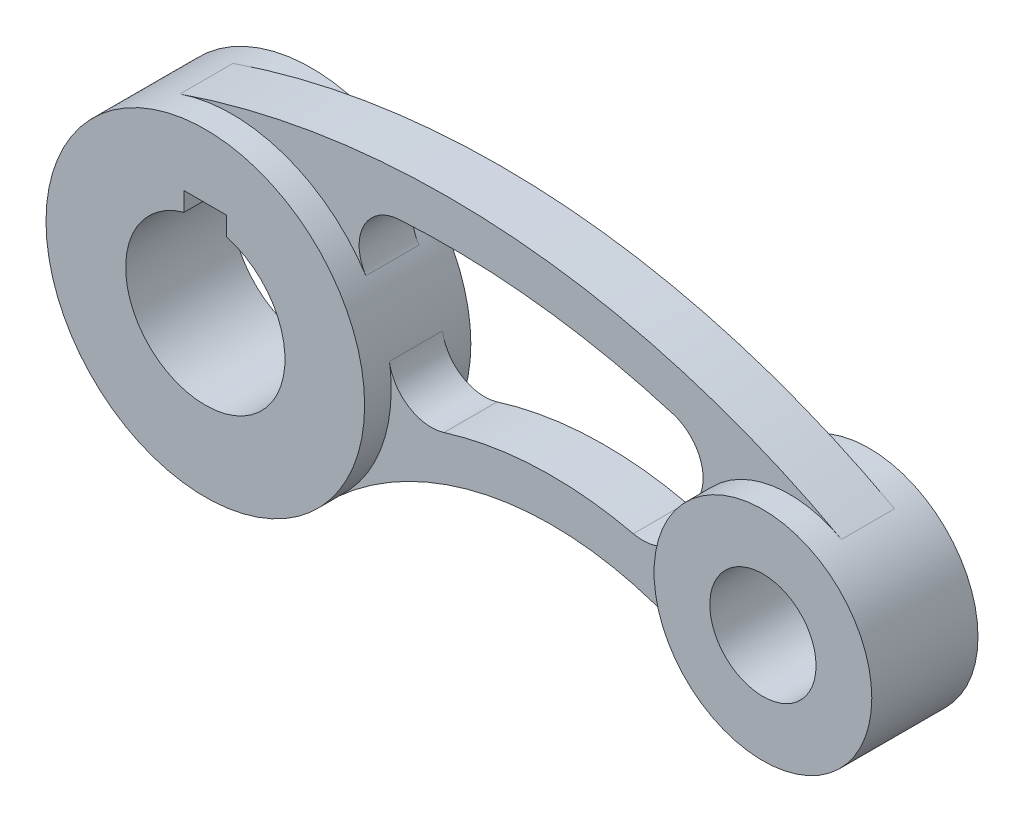
ISO-10303-21;
HEADER;
FILE_DESCRIPTION(('STEP AP214'),'2;1');
FILE_NAME('part.step','',(''),(''),'','','');
FILE_SCHEMA(('AUTOMOTIVE_DESIGN { 1 0 10303 214 1 1 1 1 }'));
ENDSEC;
DATA;
#1=APPLICATION_CONTEXT('core data for automotive mechanical design processes');
#2=APPLICATION_PROTOCOL_DEFINITION('international standard','automotive_design',2000,#1);
#3=PRODUCT_CONTEXT('',#1,'mechanical');
#4=PRODUCT('Part','Part','',(#3));
#5=PRODUCT_RELATED_PRODUCT_CATEGORY('part','',(#4));
#6=PRODUCT_DEFINITION_FORMATION('','',#4);
#7=PRODUCT_DEFINITION_CONTEXT('part definition',#1,'design');
#8=PRODUCT_DEFINITION('design','',#6,#7);
#9=PRODUCT_DEFINITION_SHAPE('','',#8);
#10=(LENGTH_UNIT() NAMED_UNIT(*) SI_UNIT(.MILLI.,.METRE.));
#11=(NAMED_UNIT(*) PLANE_ANGLE_UNIT() SI_UNIT($,.RADIAN.));
#12=(NAMED_UNIT(*) SI_UNIT($,.STERADIAN.) SOLID_ANGLE_UNIT());
#13=UNCERTAINTY_MEASURE_WITH_UNIT(LENGTH_MEASURE(1.E-05),#10,'distance_accuracy_value','');
#14=(GEOMETRIC_REPRESENTATION_CONTEXT(3) GLOBAL_UNCERTAINTY_ASSIGNED_CONTEXT((#13)) GLOBAL_UNIT_ASSIGNED_CONTEXT((#10,
#11,#12)) REPRESENTATION_CONTEXT('',''));
#15=CARTESIAN_POINT('',(0.,0.,0.));
#16=DIRECTION('',(0.,0.,1.));
#17=DIRECTION('',(1.,0.,0.));
#18=AXIS2_PLACEMENT_3D('',#15,#16,#17);
#19=CARTESIAN_POINT('',(-105.,0.,-10.));
#20=DIRECTION('',(0.,0.,1.));
#21=DIRECTION('',(1.,0.,0.));
#22=AXIS2_PLACEMENT_3D('',#19,#20,#21);
#23=CYLINDRICAL_SURFACE('',#22,30.);
#24=CARTESIAN_POINT('',(-105.,0.,-10.));
#25=DIRECTION('',(0.,0.,1.));
#26=DIRECTION('',(1.,0.,0.));
#27=AXIS2_PLACEMENT_3D('',#24,#25,#26);
#28=CIRCLE('',#27,30.);
#29=CARTESIAN_POINT('',(-75.,0.,-10.));
#30=VERTEX_POINT('',#29);
#31=EDGE_CURVE('E287',#30,#30,#28,.T.);
#32=ORIENTED_EDGE('',*,*,#31,.T.);
#33=EDGE_LOOP('',(#32));
#34=FACE_BOUND('',#33,.T.);
#35=CARTESIAN_POINT('',(-105.,0.,10.));
#36=DIRECTION('',(0.,0.,1.));
#37=DIRECTION('',(1.,0.,0.));
#38=AXIS2_PLACEMENT_3D('',#35,#36,#37);
#39=CIRCLE('',#38,30.);
#40=CARTESIAN_POINT('',(-75.,0.,10.));
#41=VERTEX_POINT('',#40);
#42=EDGE_CURVE('E275',#41,#41,#39,.T.);
#43=ORIENTED_EDGE('',*,*,#42,.F.);
#44=EDGE_LOOP('',(#43));
#45=FACE_BOUND('',#44,.T.);
#46=DIRECTION('',(0.,0.,1.));
#47=VECTOR('',#46,1.);
#48=CARTESIAN_POINT('',(-114.782571428571,28.3602062094918,-5.));
#49=LINE('',#48,#47);
#50=CARTESIAN_POINT('',(-114.782571428571,28.3602062094918,-5.));
#51=VERTEX_POINT('',#50);
#52=CARTESIAN_POINT('',(-114.782571428571,28.3602062094918,5.));
#53=VERTEX_POINT('',#52);
#54=EDGE_CURVE('E261',#51,#53,#49,.T.);
#55=ORIENTED_EDGE('',*,*,#54,.F.);
#56=CARTESIAN_POINT('',(-105.,0.,-5.));
#57=DIRECTION('',(0.,0.,1.));
#58=DIRECTION('',(1.,0.,0.));
#59=AXIS2_PLACEMENT_3D('',#56,#57,#58);
#60=CIRCLE('',#59,30.);
#61=CARTESIAN_POINT('',(-79.7671344661695,16.2265984405737,-5.));
#62=VERTEX_POINT('',#61);
#63=EDGE_CURVE('E239',#62,#51,#60,.T.);
#64=ORIENTED_EDGE('',*,*,#63,.F.);
#65=DIRECTION('',(0.,0.,1.));
#66=VECTOR('',#65,1.);
#67=CARTESIAN_POINT('',(-79.7671344661695,16.2265984405737,-5.));
#68=LINE('',#67,#66);
#69=CARTESIAN_POINT('',(-79.7671344661695,16.2265984405737,5.));
#70=VERTEX_POINT('',#69);
#71=EDGE_CURVE('E259',#62,#70,#68,.T.);
#72=ORIENTED_EDGE('',*,*,#71,.T.);
#73=CARTESIAN_POINT('',(-105.,0.,5.));
#74=DIRECTION('',(0.,0.,1.));
#75=DIRECTION('',(1.,0.,0.));
#76=AXIS2_PLACEMENT_3D('',#73,#74,#75);
#77=CIRCLE('',#76,30.);
#78=EDGE_CURVE('E223',#70,#53,#77,.T.);
#79=ORIENTED_EDGE('',*,*,#78,.T.);
#80=EDGE_LOOP('',(#55,#64,#72,#79));
#81=FACE_BOUND('',#80,.T.);
#82=CARTESIAN_POINT('',(-105.,0.,-5.));
#83=DIRECTION('',(0.,0.,1.));
#84=DIRECTION('',(1.,0.,0.));
#85=AXIS2_PLACEMENT_3D('',#82,#83,#84);
#86=CIRCLE('',#85,30.);
#87=CARTESIAN_POINT('',(-84.9289682539683,-22.2969433925322,-5.));
#88=VERTEX_POINT('',#87);
#89=CARTESIAN_POINT('',(-75.3346025355009,4.46813084782583,-5.));
#90=VERTEX_POINT('',#89);
#91=EDGE_CURVE('E183',#88,#90,#86,.T.);
#92=ORIENTED_EDGE('',*,*,#91,.F.);
#93=DIRECTION('',(0.,0.,-1.));
#94=VECTOR('',#93,1.);
#95=CARTESIAN_POINT('',(-84.9289682539682,-22.2969433925322,5.));
#96=LINE('',#95,#94);
#97=CARTESIAN_POINT('',(-84.9289682539682,-22.2969433925322,5.));
#98=VERTEX_POINT('',#97);
#99=EDGE_CURVE('E54',#98,#88,#96,.T.);
#100=ORIENTED_EDGE('',*,*,#99,.F.);
#101=CARTESIAN_POINT('',(-105.,0.,5.));
#102=DIRECTION('',(0.,0.,1.));
#103=DIRECTION('',(1.,0.,0.));
#104=AXIS2_PLACEMENT_3D('',#101,#102,#103);
#105=CIRCLE('',#104,30.);
#106=CARTESIAN_POINT('',(-75.3346025355009,4.46813084782583,5.));
#107=VERTEX_POINT('',#106);
#108=EDGE_CURVE('E195',#98,#107,#105,.T.);
#109=ORIENTED_EDGE('',*,*,#108,.T.);
#110=DIRECTION('',(0.,0.,-1.));
#111=VECTOR('',#110,1.);
#112=CARTESIAN_POINT('',(-75.3346025355009,4.46813084782583,5.));
#113=LINE('',#112,#111);
#114=EDGE_CURVE('E61',#107,#90,#113,.T.);
#115=ORIENTED_EDGE('',*,*,#114,.T.);
#116=EDGE_LOOP('',(#92,#100,#109,#115));
#117=FACE_BOUND('',#116,.T.);
#118=ADVANCED_FACE('F37',(#34,#45,#81,#117),#23,.T.);
#119=CARTESIAN_POINT('',(-105.,0.,-10.));
#120=DIRECTION('',(0.,0.,1.));
#121=DIRECTION('',(1.,0.,0.));
#122=AXIS2_PLACEMENT_3D('',#119,#120,#121);
#123=CYLINDRICAL_SURFACE('',#122,15.);
#124=DIRECTION('',(0.,0.,1.));
#125=VECTOR('',#124,1.);
#126=CARTESIAN_POINT('',(-109.,14.456832294801,-10.));
#127=LINE('',#126,#125);
#128=CARTESIAN_POINT('',(-109.,14.456832294801,-10.));
#129=VERTEX_POINT('',#128);
#130=CARTESIAN_POINT('',(-109.,14.456832294801,10.));
#131=VERTEX_POINT('',#130);
#132=EDGE_CURVE('E41',#129,#131,#127,.T.);
#133=ORIENTED_EDGE('',*,*,#132,.T.);
#134=CARTESIAN_POINT('',(-105.,0.,10.));
#135=DIRECTION('',(0.,0.,1.));
#136=DIRECTION('',(1.,0.,0.));
#137=AXIS2_PLACEMENT_3D('',#134,#135,#136);
#138=CIRCLE('',#137,15.);
#139=CARTESIAN_POINT('',(-101.,14.456832294801,10.));
#140=VERTEX_POINT('',#139);
#141=EDGE_CURVE('E254',#131,#140,#138,.T.);
#142=ORIENTED_EDGE('',*,*,#141,.T.);
#143=DIRECTION('',(0.,0.,1.));
#144=VECTOR('',#143,1.);
#145=CARTESIAN_POINT('',(-101.,14.456832294801,-10.));
#146=LINE('',#145,#144);
#147=CARTESIAN_POINT('',(-101.,14.456832294801,-10.));
#148=VERTEX_POINT('',#147);
#149=EDGE_CURVE('E11',#148,#140,#146,.T.);
#150=ORIENTED_EDGE('',*,*,#149,.F.);
#151=CARTESIAN_POINT('',(-105.,0.,-10.));
#152=DIRECTION('',(0.,0.,1.));
#153=DIRECTION('',(1.,0.,0.));
#154=AXIS2_PLACEMENT_3D('',#151,#152,#153);
#155=CIRCLE('',#154,15.);
#156=EDGE_CURVE('E278',#129,#148,#155,.T.);
#157=ORIENTED_EDGE('',*,*,#156,.F.);
#158=EDGE_LOOP('',(#133,#142,#150,#157));
#159=FACE_BOUND('',#158,.T.);
#160=ADVANCED_FACE('F39',(#159),#123,.F.);
#161=CARTESIAN_POINT('',(-101.,0.,-10.));
#162=DIRECTION('',(1.,0.,0.));
#163=DIRECTION('',(0.,0.,-1.));
#164=AXIS2_PLACEMENT_3D('',#161,#162,#163);
#165=PLANE('',#164);
#166=ORIENTED_EDGE('',*,*,#149,.T.);
#167=DIRECTION('',(0.,1.,0.));
#168=VECTOR('',#167,1.);
#169=CARTESIAN_POINT('',(-101.,0.,10.));
#170=LINE('',#169,#168);
#171=CARTESIAN_POINT('',(-101.,18.,10.));
#172=VERTEX_POINT('',#171);
#173=EDGE_CURVE('E272',#140,#172,#170,.T.);
#174=ORIENTED_EDGE('',*,*,#173,.T.);
#175=DIRECTION('',(0.,0.,1.));
#176=VECTOR('',#175,1.);
#177=CARTESIAN_POINT('',(-101.,18.,-10.));
#178=LINE('',#177,#176);
#179=CARTESIAN_POINT('',(-101.,18.,-10.));
#180=VERTEX_POINT('',#179);
#181=EDGE_CURVE('E46',#180,#172,#178,.T.);
#182=ORIENTED_EDGE('',*,*,#181,.F.);
#183=DIRECTION('',(0.,1.,0.));
#184=VECTOR('',#183,1.);
#185=CARTESIAN_POINT('',(-101.,0.,-10.));
#186=LINE('',#185,#184);
#187=EDGE_CURVE('E285',#148,#180,#186,.T.);
#188=ORIENTED_EDGE('',*,*,#187,.F.);
#189=EDGE_LOOP('',(#166,#174,#182,#188));
#190=FACE_BOUND('',#189,.T.);
#191=ADVANCED_FACE('F315',(#190),#165,.F.);
#192=CARTESIAN_POINT('',(0.,18.,-10.));
#193=DIRECTION('',(0.,1.,0.));
#194=DIRECTION('',(0.,0.,1.));
#195=AXIS2_PLACEMENT_3D('',#192,#193,#194);
#196=PLANE('',#195);
#197=ORIENTED_EDGE('',*,*,#181,.T.);
#198=DIRECTION('',(-1.,0.,0.));
#199=VECTOR('',#198,1.);
#200=CARTESIAN_POINT('',(0.,18.,10.));
#201=LINE('',#200,#199);
#202=CARTESIAN_POINT('',(-109.,18.,10.));
#203=VERTEX_POINT('',#202);
#204=EDGE_CURVE('E269',#172,#203,#201,.T.);
#205=ORIENTED_EDGE('',*,*,#204,.T.);
#206=DIRECTION('',(0.,0.,1.));
#207=VECTOR('',#206,1.);
#208=CARTESIAN_POINT('',(-109.,18.,-10.));
#209=LINE('',#208,#207);
#210=CARTESIAN_POINT('',(-109.,18.,-10.));
#211=VERTEX_POINT('',#210);
#212=EDGE_CURVE('E290',#211,#203,#209,.T.);
#213=ORIENTED_EDGE('',*,*,#212,.F.);
#214=DIRECTION('',(-1.,0.,0.));
#215=VECTOR('',#214,1.);
#216=CARTESIAN_POINT('',(0.,18.,-10.));
#217=LINE('',#216,#215);
#218=EDGE_CURVE('E283',#180,#211,#217,.T.);
#219=ORIENTED_EDGE('',*,*,#218,.F.);
#220=EDGE_LOOP('',(#197,#205,#213,#219));
#221=FACE_BOUND('',#220,.T.);
#222=ADVANCED_FACE('F308',(#221),#196,.F.);
#223=CARTESIAN_POINT('',(-109.,0.,-10.));
#224=DIRECTION('',(-1.,0.,0.));
#225=DIRECTION('',(0.,0.,1.));
#226=AXIS2_PLACEMENT_3D('',#223,#224,#225);
#227=PLANE('',#226);
#228=ORIENTED_EDGE('',*,*,#212,.T.);
#229=DIRECTION('',(0.,-1.,0.));
#230=VECTOR('',#229,1.);
#231=CARTESIAN_POINT('',(-109.,0.,10.));
#232=LINE('',#231,#230);
#233=EDGE_CURVE('E266',#203,#131,#232,.T.);
#234=ORIENTED_EDGE('',*,*,#233,.T.);
#235=ORIENTED_EDGE('',*,*,#132,.F.);
#236=DIRECTION('',(0.,-1.,0.));
#237=VECTOR('',#236,1.);
#238=CARTESIAN_POINT('',(-109.,0.,-10.));
#239=LINE('',#238,#237);
#240=EDGE_CURVE('E281',#211,#129,#239,.T.);
#241=ORIENTED_EDGE('',*,*,#240,.F.);
#242=EDGE_LOOP('',(#228,#234,#235,#241));
#243=FACE_BOUND('',#242,.T.);
#244=ADVANCED_FACE('F305',(#243),#227,.F.);
#245=CARTESIAN_POINT('',(0.,0.,-10.));
#246=DIRECTION('',(0.,0.,1.));
#247=DIRECTION('',(1.,0.,0.));
#248=AXIS2_PLACEMENT_3D('',#245,#246,#247);
#249=PLANE('',#248);
#250=ORIENTED_EDGE('',*,*,#156,.T.);
#251=ORIENTED_EDGE('',*,*,#187,.T.);
#252=ORIENTED_EDGE('',*,*,#218,.T.);
#253=ORIENTED_EDGE('',*,*,#240,.T.);
#254=EDGE_LOOP('',(#250,#251,#252,#253));
#255=FACE_BOUND('',#254,.T.);
#256=ORIENTED_EDGE('',*,*,#31,.F.);
#257=EDGE_LOOP('',(#256));
#258=FACE_BOUND('',#257,.T.);
#259=ADVANCED_FACE('F307',(#255,#258),#249,.F.);
#260=CARTESIAN_POINT('',(0.,0.,10.));
#261=DIRECTION('',(0.,0.,1.));
#262=DIRECTION('',(1.,0.,0.));
#263=AXIS2_PLACEMENT_3D('',#260,#261,#262);
#264=PLANE('',#263);
#265=ORIENTED_EDGE('',*,*,#141,.F.);
#266=ORIENTED_EDGE('',*,*,#233,.F.);
#267=ORIENTED_EDGE('',*,*,#204,.F.);
#268=ORIENTED_EDGE('',*,*,#173,.F.);
#269=EDGE_LOOP('',(#265,#266,#267,#268));
#270=FACE_BOUND('',#269,.T.);
#271=ORIENTED_EDGE('',*,*,#42,.T.);
#272=EDGE_LOOP('',(#271));
#273=FACE_BOUND('',#272,.T.);
#274=ADVANCED_FACE('F302',(#270,#273),#264,.T.);
#275=CARTESIAN_POINT('',(-24.2588248443126,14.9585900797153,-5.));
#276=DIRECTION('',(0.,0.,1.));
#277=DIRECTION('',(1.,0.,0.));
#278=AXIS2_PLACEMENT_3D('',#275,#276,#277);
#279=CYLINDRICAL_SURFACE('',#278,8.);
#280=CARTESIAN_POINT('',(-24.2588248443126,14.9585900797153,5.));
#281=DIRECTION('',(0.,0.,1.));
#282=DIRECTION('',(1.,0.,0.));
#283=AXIS2_PLACEMENT_3D('',#280,#281,#282);
#284=CIRCLE('',#283,8.);
#285=CARTESIAN_POINT('',(-21.9577911251774,22.6205248108001,5.));
#286=VERTEX_POINT('',#285);
#287=CARTESIAN_POINT('',(-17.4493301511723,10.7596876011987,5.));
#288=VERTEX_POINT('',#287);
#289=EDGE_CURVE('E232',#286,#288,#284,.F.);
#290=ORIENTED_EDGE('',*,*,#289,.F.);
#291=DIRECTION('',(0.,0.,1.));
#292=VECTOR('',#291,1.);
#293=CARTESIAN_POINT('',(-21.9577911251774,22.6205248108001,-5.));
#294=LINE('',#293,#292);
#295=CARTESIAN_POINT('',(-21.9577911251774,22.6205248108001,-5.));
#296=VERTEX_POINT('',#295);
#297=EDGE_CURVE('E255',#296,#286,#294,.T.);
#298=ORIENTED_EDGE('',*,*,#297,.F.);
#299=CARTESIAN_POINT('',(-24.2588248443126,14.9585900797153,-5.));
#300=DIRECTION('',(0.,0.,1.));
#301=DIRECTION('',(1.,0.,0.));
#302=AXIS2_PLACEMENT_3D('',#299,#300,#301);
#303=CIRCLE('',#302,8.);
#304=CARTESIAN_POINT('',(-17.4493301511722,10.7596876011987,-5.));
#305=VERTEX_POINT('',#304);
#306=EDGE_CURVE('E248',#296,#305,#303,.F.);
#307=ORIENTED_EDGE('',*,*,#306,.T.);
#308=DIRECTION('',(0.,0.,1.));
#309=VECTOR('',#308,1.);
#310=CARTESIAN_POINT('',(-17.4493301511722,10.7596876011987,-5.));
#311=LINE('',#310,#309);
#312=EDGE_CURVE('E252',#305,#288,#311,.T.);
#313=ORIENTED_EDGE('',*,*,#312,.T.);
#314=EDGE_LOOP('',(#290,#298,#307,#313));
#315=FACE_BOUND('',#314,.T.);
#316=ADVANCED_FACE('F360',(#315),#279,.F.);
#317=CARTESIAN_POINT('',(-64.2392857142857,-118.167525872883,-5.));
#318=DIRECTION('',(0.,0.,1.));
#319=DIRECTION('',(1.,0.,0.));
#320=AXIS2_PLACEMENT_3D('',#317,#318,#319);
#321=CYLINDRICAL_SURFACE('',#320,147.);
#322=CARTESIAN_POINT('',(-64.2392857142857,-118.167525872883,5.));
#323=DIRECTION('',(0.,0.,1.));
#324=DIRECTION('',(1.,0.,0.));
#325=AXIS2_PLACEMENT_3D('',#322,#323,#324);
#326=CIRCLE('',#325,147.);
#327=CARTESIAN_POINT('',(-73.5447924596149,28.5376463066034,5.));
#328=VERTEX_POINT('',#327);
#329=EDGE_CURVE('E229',#328,#286,#326,.F.);
#330=ORIENTED_EDGE('',*,*,#329,.F.);
#331=DIRECTION('',(0.,0.,1.));
#332=VECTOR('',#331,1.);
#333=CARTESIAN_POINT('',(-73.5447924596149,28.5376463066034,-5.));
#334=LINE('',#333,#332);
#335=CARTESIAN_POINT('',(-73.5447924596149,28.5376463066034,-5.));
#336=VERTEX_POINT('',#335);
#337=EDGE_CURVE('E257',#336,#328,#334,.T.);
#338=ORIENTED_EDGE('',*,*,#337,.F.);
#339=CARTESIAN_POINT('',(-64.2392857142857,-118.167525872883,-5.));
#340=DIRECTION('',(0.,0.,1.));
#341=DIRECTION('',(1.,0.,0.));
#342=AXIS2_PLACEMENT_3D('',#339,#340,#341);
#343=CIRCLE('',#342,147.);
#344=EDGE_CURVE('E245',#336,#296,#343,.F.);
#345=ORIENTED_EDGE('',*,*,#344,.T.);
#346=ORIENTED_EDGE('',*,*,#297,.T.);
#347=EDGE_LOOP('',(#330,#338,#345,#346));
#348=FACE_BOUND('',#347,.T.);
#349=ADVANCED_FACE('F375',(#348),#321,.F.);
#350=CARTESIAN_POINT('',(-73.0383703238147,20.55369135806,-5.));
#351=DIRECTION('',(0.,0.,1.));
#352=DIRECTION('',(1.,0.,0.));
#353=AXIS2_PLACEMENT_3D('',#350,#351,#352);
#354=CYLINDRICAL_SURFACE('',#353,8.);
#355=CARTESIAN_POINT('',(-73.0383703238147,20.55369135806,5.));
#356=DIRECTION('',(0.,0.,1.));
#357=DIRECTION('',(1.,0.,0.));
#358=AXIS2_PLACEMENT_3D('',#355,#356,#357);
#359=CIRCLE('',#358,8.);
#360=EDGE_CURVE('E226',#328,#70,#359,.T.);
#361=ORIENTED_EDGE('',*,*,#360,.T.);
#362=ORIENTED_EDGE('',*,*,#71,.F.);
#363=CARTESIAN_POINT('',(-73.0383703238147,20.55369135806,-5.));
#364=DIRECTION('',(0.,0.,1.));
#365=DIRECTION('',(1.,0.,0.));
#366=AXIS2_PLACEMENT_3D('',#363,#364,#365);
#367=CIRCLE('',#366,8.);
#368=EDGE_CURVE('E242',#336,#62,#367,.T.);
#369=ORIENTED_EDGE('',*,*,#368,.F.);
#370=ORIENTED_EDGE('',*,*,#337,.T.);
#371=EDGE_LOOP('',(#361,#362,#369,#370));
#372=FACE_BOUND('',#371,.T.);
#373=ADVANCED_FACE('F385',(#372),#354,.F.);
#374=CARTESIAN_POINT('',(-64.2392857142857,-118.167525872883,-5.));
#375=DIRECTION('',(0.,0.,1.));
#376=DIRECTION('',(1.,0.,0.));
#377=AXIS2_PLACEMENT_3D('',#374,#375,#376);
#378=CYLINDRICAL_SURFACE('',#377,155.);
#379=CARTESIAN_POINT('',(-64.2392857142857,-118.167525872883,5.));
#380=DIRECTION('',(0.,0.,1.));
#381=DIRECTION('',(1.,0.,0.));
#382=AXIS2_PLACEMENT_3D('',#379,#380,#381);
#383=CIRCLE('',#382,155.);
#384=CARTESIAN_POINT('',(9.7911178969729,18.0106637947516,5.));
#385=VERTEX_POINT('',#384);
#386=EDGE_CURVE('E220',#53,#385,#383,.F.);
#387=ORIENTED_EDGE('',*,*,#386,.T.);
#388=DIRECTION('',(0.,0.,1.));
#389=VECTOR('',#388,1.);
#390=CARTESIAN_POINT('',(9.7911178969729,18.0106637947516,-5.));
#391=LINE('',#390,#389);
#392=CARTESIAN_POINT('',(9.7911178969729,18.0106637947516,-5.));
#393=VERTEX_POINT('',#392);
#394=EDGE_CURVE('E251',#393,#385,#391,.T.);
#395=ORIENTED_EDGE('',*,*,#394,.F.);
#396=CARTESIAN_POINT('',(-64.2392857142857,-118.167525872883,-5.));
#397=DIRECTION('',(0.,0.,1.));
#398=DIRECTION('',(1.,0.,0.));
#399=AXIS2_PLACEMENT_3D('',#396,#397,#398);
#400=CIRCLE('',#399,155.);
#401=EDGE_CURVE('E237',#51,#393,#400,.F.);
#402=ORIENTED_EDGE('',*,*,#401,.F.);
#403=ORIENTED_EDGE('',*,*,#54,.T.);
#404=EDGE_LOOP('',(#387,#395,#402,#403));
#405=FACE_BOUND('',#404,.T.);
#406=ADVANCED_FACE('F395',(#405),#378,.T.);
#407=CARTESIAN_POINT('',(0.,0.,-5.));
#408=DIRECTION('',(0.,0.,1.));
#409=DIRECTION('',(1.,0.,0.));
#410=AXIS2_PLACEMENT_3D('',#407,#408,#409);
#411=PLANE('',#410);
#412=CARTESIAN_POINT('',(0.,0.,-5.));
#413=DIRECTION('',(0.,0.,1.));
#414=DIRECTION('',(1.,0.,0.));
#415=AXIS2_PLACEMENT_3D('',#412,#413,#414);
#416=CIRCLE('',#415,20.5);
#417=EDGE_CURVE('E235',#393,#305,#416,.T.);
#418=ORIENTED_EDGE('',*,*,#417,.T.);
#419=ORIENTED_EDGE('',*,*,#306,.F.);
#420=ORIENTED_EDGE('',*,*,#344,.F.);
#421=ORIENTED_EDGE('',*,*,#368,.T.);
#422=ORIENTED_EDGE('',*,*,#63,.T.);
#423=ORIENTED_EDGE('',*,*,#401,.T.);
#424=EDGE_LOOP('',(#418,#419,#420,#421,#422,#423));
#425=FACE_BOUND('',#424,.T.);
#426=ADVANCED_FACE('F405',(#425),#411,.F.);
#427=CARTESIAN_POINT('',(0.,0.,5.));
#428=DIRECTION('',(0.,0.,1.));
#429=DIRECTION('',(1.,0.,0.));
#430=AXIS2_PLACEMENT_3D('',#427,#428,#429);
#431=PLANE('',#430);
#432=CARTESIAN_POINT('',(0.,0.,5.));
#433=DIRECTION('',(0.,0.,1.));
#434=DIRECTION('',(1.,0.,0.));
#435=AXIS2_PLACEMENT_3D('',#432,#433,#434);
#436=CIRCLE('',#435,20.5);
#437=EDGE_CURVE('E217',#385,#288,#436,.T.);
#438=ORIENTED_EDGE('',*,*,#437,.F.);
#439=ORIENTED_EDGE('',*,*,#386,.F.);
#440=ORIENTED_EDGE('',*,*,#78,.F.);
#441=ORIENTED_EDGE('',*,*,#360,.F.);
#442=ORIENTED_EDGE('',*,*,#329,.T.);
#443=ORIENTED_EDGE('',*,*,#289,.T.);
#444=EDGE_LOOP('',(#438,#439,#440,#441,#442,#443));
#445=FACE_BOUND('',#444,.T.);
#446=ADVANCED_FACE('F415',(#445),#431,.T.);
#447=CARTESIAN_POINT('',(0.,0.,-10.));
#448=DIRECTION('',(0.,0.,1.));
#449=DIRECTION('',(1.,0.,0.));
#450=AXIS2_PLACEMENT_3D('',#447,#448,#449);
#451=CYLINDRICAL_SURFACE('',#450,20.5);
#452=DIRECTION('',(0.,0.,-1.));
#453=VECTOR('',#452,1.);
#454=CARTESIAN_POINT('',(-11.4053608399882,-17.0343107905681,5.));
#455=LINE('',#454,#453);
#456=CARTESIAN_POINT('',(-11.4053608399882,-17.0343107905681,5.));
#457=VERTEX_POINT('',#456);
#458=CARTESIAN_POINT('',(-11.4053608399882,-17.0343107905681,-5.));
#459=VERTEX_POINT('',#458);
#460=EDGE_CURVE('E199',#457,#459,#455,.T.);
#461=ORIENTED_EDGE('',*,*,#460,.T.);
#462=CARTESIAN_POINT('',(0.,0.,-5.));
#463=DIRECTION('',(0.,0.,1.));
#464=DIRECTION('',(1.,0.,0.));
#465=AXIS2_PLACEMENT_3D('',#462,#463,#464);
#466=CIRCLE('',#465,20.5);
#467=CARTESIAN_POINT('',(-19.8465572357473,5.1346047450806,-5.));
#468=VERTEX_POINT('',#467);
#469=EDGE_CURVE('E178',#468,#459,#466,.T.);
#470=ORIENTED_EDGE('',*,*,#469,.F.);
#471=DIRECTION('',(0.,0.,-1.));
#472=VECTOR('',#471,1.);
#473=CARTESIAN_POINT('',(-19.8465572357473,5.1346047450806,5.));
#474=LINE('',#473,#472);
#475=CARTESIAN_POINT('',(-19.8465572357473,5.1346047450806,5.));
#476=VERTEX_POINT('',#475);
#477=EDGE_CURVE('E164',#476,#468,#474,.T.);
#478=ORIENTED_EDGE('',*,*,#477,.F.);
#479=CARTESIAN_POINT('',(0.,0.,5.));
#480=DIRECTION('',(0.,0.,1.));
#481=DIRECTION('',(1.,0.,0.));
#482=AXIS2_PLACEMENT_3D('',#479,#480,#481);
#483=CIRCLE('',#482,20.5);
#484=EDGE_CURVE('E187',#476,#457,#483,.T.);
#485=ORIENTED_EDGE('',*,*,#484,.T.);
#486=EDGE_LOOP('',(#461,#470,#478,#485));
#487=FACE_BOUND('',#486,.T.);
#488=CARTESIAN_POINT('',(0.,0.,10.));
#489=DIRECTION('',(0.,0.,1.));
#490=DIRECTION('',(1.,0.,0.));
#491=AXIS2_PLACEMENT_3D('',#488,#489,#490);
#492=CIRCLE('',#491,20.5);
#493=CARTESIAN_POINT('',(20.5,0.,10.));
#494=VERTEX_POINT('',#493);
#495=EDGE_CURVE('E208',#494,#494,#492,.T.);
#496=ORIENTED_EDGE('',*,*,#495,.F.);
#497=EDGE_LOOP('',(#496));
#498=FACE_BOUND('',#497,.T.);
#499=CARTESIAN_POINT('',(0.,0.,-10.));
#500=DIRECTION('',(0.,0.,1.));
#501=DIRECTION('',(1.,0.,0.));
#502=AXIS2_PLACEMENT_3D('',#499,#500,#501);
#503=CIRCLE('',#502,20.5);
#504=CARTESIAN_POINT('',(20.5,0.,-10.));
#505=VERTEX_POINT('',#504);
#506=EDGE_CURVE('E214',#505,#505,#503,.T.);
#507=ORIENTED_EDGE('',*,*,#506,.T.);
#508=EDGE_LOOP('',(#507));
#509=FACE_BOUND('',#508,.T.);
#510=ORIENTED_EDGE('',*,*,#417,.F.);
#511=ORIENTED_EDGE('',*,*,#394,.T.);
#512=ORIENTED_EDGE('',*,*,#437,.T.);
#513=ORIENTED_EDGE('',*,*,#312,.F.);
#514=EDGE_LOOP('',(#510,#511,#512,#513));
#515=FACE_BOUND('',#514,.T.);
#516=ADVANCED_FACE('F425',(#487,#498,#509,#515),#451,.T.);
#517=CARTESIAN_POINT('',(0.,0.,-10.));
#518=DIRECTION('',(0.,0.,1.));
#519=DIRECTION('',(1.,0.,0.));
#520=AXIS2_PLACEMENT_3D('',#517,#518,#519);
#521=CYLINDRICAL_SURFACE('',#520,10.);
#522=CARTESIAN_POINT('',(0.,0.,-10.));
#523=DIRECTION('',(0.,0.,1.));
#524=DIRECTION('',(1.,0.,0.));
#525=AXIS2_PLACEMENT_3D('',#522,#523,#524);
#526=CIRCLE('',#525,10.);
#527=CARTESIAN_POINT('',(10.,0.,-10.));
#528=VERTEX_POINT('',#527);
#529=EDGE_CURVE('E211',#528,#528,#526,.T.);
#530=ORIENTED_EDGE('',*,*,#529,.F.);
#531=EDGE_LOOP('',(#530));
#532=FACE_BOUND('',#531,.T.);
#533=CARTESIAN_POINT('',(0.,0.,10.));
#534=DIRECTION('',(0.,0.,1.));
#535=DIRECTION('',(1.,0.,0.));
#536=AXIS2_PLACEMENT_3D('',#533,#534,#535);
#537=CIRCLE('',#536,10.);
#538=CARTESIAN_POINT('',(10.,0.,10.));
#539=VERTEX_POINT('',#538);
#540=EDGE_CURVE('E205',#539,#539,#537,.T.);
#541=ORIENTED_EDGE('',*,*,#540,.T.);
#542=EDGE_LOOP('',(#541));
#543=FACE_BOUND('',#542,.T.);
#544=ADVANCED_FACE('F435',(#532,#543),#521,.F.);
#545=CARTESIAN_POINT('',(0.,0.,-10.));
#546=DIRECTION('',(0.,0.,1.));
#547=DIRECTION('',(1.,0.,0.));
#548=AXIS2_PLACEMENT_3D('',#545,#546,#547);
#549=PLANE('',#548);
#550=ORIENTED_EDGE('',*,*,#529,.T.);
#551=EDGE_LOOP('',(#550));
#552=FACE_BOUND('',#551,.T.);
#553=ORIENTED_EDGE('',*,*,#506,.F.);
#554=EDGE_LOOP('',(#553));
#555=FACE_BOUND('',#554,.T.);
#556=ADVANCED_FACE('F447',(#552,#555),#549,.F.);
#557=CARTESIAN_POINT('',(0.,0.,10.));
#558=DIRECTION('',(0.,0.,1.));
#559=DIRECTION('',(1.,0.,0.));
#560=AXIS2_PLACEMENT_3D('',#557,#558,#559);
#561=PLANE('',#560);
#562=ORIENTED_EDGE('',*,*,#540,.F.);
#563=EDGE_LOOP('',(#562));
#564=FACE_BOUND('',#563,.T.);
#565=ORIENTED_EDGE('',*,*,#495,.T.);
#566=EDGE_LOOP('',(#565));
#567=FACE_BOUND('',#566,.T.);
#568=ADVANCED_FACE('F458',(#564,#567),#561,.T.);
#569=CARTESIAN_POINT('',(-27.5915551814049,7.1383529382828,5.));
#570=DIRECTION('',(0.,0.,-1.));
#571=DIRECTION('',(-1.,0.,0.));
#572=AXIS2_PLACEMENT_3D('',#569,#570,#571);
#573=CYLINDRICAL_SURFACE('',#572,8.);
#574=ORIENTED_EDGE('',*,*,#477,.T.);
#575=CARTESIAN_POINT('',(-27.5915551814049,7.1383529382828,-5.));
#576=DIRECTION('',(0.,0.,1.));
#577=DIRECTION('',(1.,0.,0.));
#578=AXIS2_PLACEMENT_3D('',#575,#576,#577);
#579=CIRCLE('',#578,8.);
#580=CARTESIAN_POINT('',(-29.4015919793523,-0.654192652862415,-5.));
#581=VERTEX_POINT('',#580);
#582=EDGE_CURVE('E171',#581,#468,#579,.T.);
#583=ORIENTED_EDGE('',*,*,#582,.F.);
#584=DIRECTION('',(0.,0.,-1.));
#585=VECTOR('',#584,1.);
#586=CARTESIAN_POINT('',(-29.4015919793523,-0.654192652862415,5.));
#587=LINE('',#586,#585);
#588=CARTESIAN_POINT('',(-29.4015919793523,-0.654192652862415,5.));
#589=VERTEX_POINT('',#588);
#590=EDGE_CURVE('E153',#589,#581,#587,.T.);
#591=ORIENTED_EDGE('',*,*,#590,.F.);
#592=CARTESIAN_POINT('',(-27.5915551814049,7.1383529382828,5.));
#593=DIRECTION('',(0.,0.,1.));
#594=DIRECTION('',(1.,0.,0.));
#595=AXIS2_PLACEMENT_3D('',#592,#593,#594);
#596=CIRCLE('',#595,8.);
#597=EDGE_CURVE('E190',#589,#476,#596,.T.);
#598=ORIENTED_EDGE('',*,*,#597,.T.);
#599=EDGE_LOOP('',(#574,#583,#591,#598));
#600=FACE_BOUND('',#599,.T.);
#601=ADVANCED_FACE('F175',(#600),#573,.F.);
#602=CARTESIAN_POINT('',(-44.7869047619048,-66.8908301775966,5.));
#603=DIRECTION('',(0.,0.,-1.));
#604=DIRECTION('',(-1.,0.,0.));
#605=AXIS2_PLACEMENT_3D('',#602,#603,#604);
#606=CYLINDRICAL_SURFACE('',#605,68.);
#607=ORIENTED_EDGE('',*,*,#590,.T.);
#608=CARTESIAN_POINT('',(-44.7869047619048,-66.8908301775966,-5.));
#609=DIRECTION('',(0.,0.,1.));
#610=DIRECTION('',(1.,0.,0.));
#611=AXIS2_PLACEMENT_3D('',#608,#609,#610);
#612=CIRCLE('',#611,68.);
#613=CARTESIAN_POINT('',(-65.0409956555226,-1.97725839115839,-5.));
#614=VERTEX_POINT('',#613);
#615=EDGE_CURVE('E156',#614,#581,#612,.F.);
#616=ORIENTED_EDGE('',*,*,#615,.F.);
#617=DIRECTION('',(0.,0.,-1.));
#618=VECTOR('',#617,1.);
#619=CARTESIAN_POINT('',(-65.0409956555226,-1.97725839115839,5.));
#620=LINE('',#619,#618);
#621=CARTESIAN_POINT('',(-65.0409956555226,-1.97725839115839,5.));
#622=VERTEX_POINT('',#621);
#623=EDGE_CURVE('E165',#622,#614,#620,.T.);
#624=ORIENTED_EDGE('',*,*,#623,.F.);
#625=CARTESIAN_POINT('',(-44.7869047619048,-66.8908301775966,5.));
#626=DIRECTION('',(0.,0.,1.));
#627=DIRECTION('',(1.,0.,0.));
#628=AXIS2_PLACEMENT_3D('',#625,#626,#627);
#629=CIRCLE('',#628,68.);
#630=EDGE_CURVE('E159',#622,#589,#629,.F.);
#631=ORIENTED_EDGE('',*,*,#630,.T.);
#632=EDGE_LOOP('',(#607,#616,#624,#631));
#633=FACE_BOUND('',#632,.T.);
#634=ADVANCED_FACE('F155',(#633),#606,.T.);
#635=CARTESIAN_POINT('',(-67.4238298783012,5.65963240724606,5.));
#636=DIRECTION('',(0.,0.,-1.));
#637=DIRECTION('',(-1.,0.,0.));
#638=AXIS2_PLACEMENT_3D('',#635,#636,#637);
#639=CYLINDRICAL_SURFACE('',#638,8.);
#640=ORIENTED_EDGE('',*,*,#623,.T.);
#641=CARTESIAN_POINT('',(-67.4238298783012,5.65963240724606,-5.));
#642=DIRECTION('',(0.,0.,1.));
#643=DIRECTION('',(1.,0.,0.));
#644=AXIS2_PLACEMENT_3D('',#641,#642,#643);
#645=CIRCLE('',#644,8.);
#646=EDGE_CURVE('E173',#614,#90,#645,.F.);
#647=ORIENTED_EDGE('',*,*,#646,.T.);
#648=ORIENTED_EDGE('',*,*,#114,.F.);
#649=CARTESIAN_POINT('',(-67.4238298783012,5.65963240724606,5.));
#650=DIRECTION('',(0.,0.,1.));
#651=DIRECTION('',(1.,0.,0.));
#652=AXIS2_PLACEMENT_3D('',#649,#650,#651);
#653=CIRCLE('',#652,8.);
#654=EDGE_CURVE('E193',#622,#107,#653,.F.);
#655=ORIENTED_EDGE('',*,*,#654,.F.);
#656=EDGE_LOOP('',(#640,#647,#648,#655));
#657=FACE_BOUND('',#656,.T.);
#658=ADVANCED_FACE('F487',(#657),#639,.F.);
#659=CARTESIAN_POINT('',(-44.7869047619048,-66.8908301775966,5.));
#660=DIRECTION('',(0.,0.,-1.));
#661=DIRECTION('',(-1.,0.,0.));
#662=AXIS2_PLACEMENT_3D('',#659,#660,#661);
#663=CYLINDRICAL_SURFACE('',#662,60.);
#664=ORIENTED_EDGE('',*,*,#99,.T.);
#665=CARTESIAN_POINT('',(-44.7869047619048,-66.8908301775966,-5.));
#666=DIRECTION('',(0.,0.,1.));
#667=DIRECTION('',(1.,0.,0.));
#668=AXIS2_PLACEMENT_3D('',#665,#666,#667);
#669=CIRCLE('',#668,60.);
#670=EDGE_CURVE('E185',#88,#459,#669,.F.);
#671=ORIENTED_EDGE('',*,*,#670,.T.);
#672=ORIENTED_EDGE('',*,*,#460,.F.);
#673=CARTESIAN_POINT('',(-44.7869047619048,-66.8908301775966,5.));
#674=DIRECTION('',(0.,0.,1.));
#675=DIRECTION('',(1.,0.,0.));
#676=AXIS2_PLACEMENT_3D('',#673,#674,#675);
#677=CIRCLE('',#676,60.);
#678=EDGE_CURVE('E197',#98,#457,#677,.F.);
#679=ORIENTED_EDGE('',*,*,#678,.F.);
#680=EDGE_LOOP('',(#664,#671,#672,#679));
#681=FACE_BOUND('',#680,.T.);
#682=ADVANCED_FACE('F497',(#681),#663,.F.);
#683=CARTESIAN_POINT('',(0.,0.,5.));
#684=DIRECTION('',(0.,0.,1.));
#685=DIRECTION('',(1.,0.,0.));
#686=AXIS2_PLACEMENT_3D('',#683,#684,#685);
#687=PLANE('',#686);
#688=ORIENTED_EDGE('',*,*,#484,.F.);
#689=ORIENTED_EDGE('',*,*,#597,.F.);
#690=ORIENTED_EDGE('',*,*,#630,.F.);
#691=ORIENTED_EDGE('',*,*,#654,.T.);
#692=ORIENTED_EDGE('',*,*,#108,.F.);
#693=ORIENTED_EDGE('',*,*,#678,.T.);
#694=EDGE_LOOP('',(#688,#689,#690,#691,#692,#693));
#695=FACE_BOUND('',#694,.T.);
#696=ADVANCED_FACE('F508',(#695),#687,.T.);
#697=CARTESIAN_POINT('',(0.,0.,-5.));
#698=DIRECTION('',(0.,0.,1.));
#699=DIRECTION('',(1.,0.,0.));
#700=AXIS2_PLACEMENT_3D('',#697,#698,#699);
#701=PLANE('',#700);
#702=ORIENTED_EDGE('',*,*,#469,.T.);
#703=ORIENTED_EDGE('',*,*,#670,.F.);
#704=ORIENTED_EDGE('',*,*,#91,.T.);
#705=ORIENTED_EDGE('',*,*,#646,.F.);
#706=ORIENTED_EDGE('',*,*,#615,.T.);
#707=ORIENTED_EDGE('',*,*,#582,.T.);
#708=EDGE_LOOP('',(#702,#703,#704,#705,#706,#707));
#709=FACE_BOUND('',#708,.T.);
#710=ADVANCED_FACE('F170',(#709),#701,.F.);
#711=CLOSED_SHELL('',(#118,#160,#191,#222,#244,#259,#274,#316,#349,#373,#406,#426,#446,#516,
#544,#556,#568,#601,#634,#658,#682,#696,#710));
#712=MANIFOLD_SOLID_BREP('B2',#711);
#713=ADVANCED_BREP_SHAPE_REPRESENTATION('',(#18,#712),#14);
#714=SHAPE_DEFINITION_REPRESENTATION(#9,#713);
ENDSEC;
END-ISO-10303-21;
